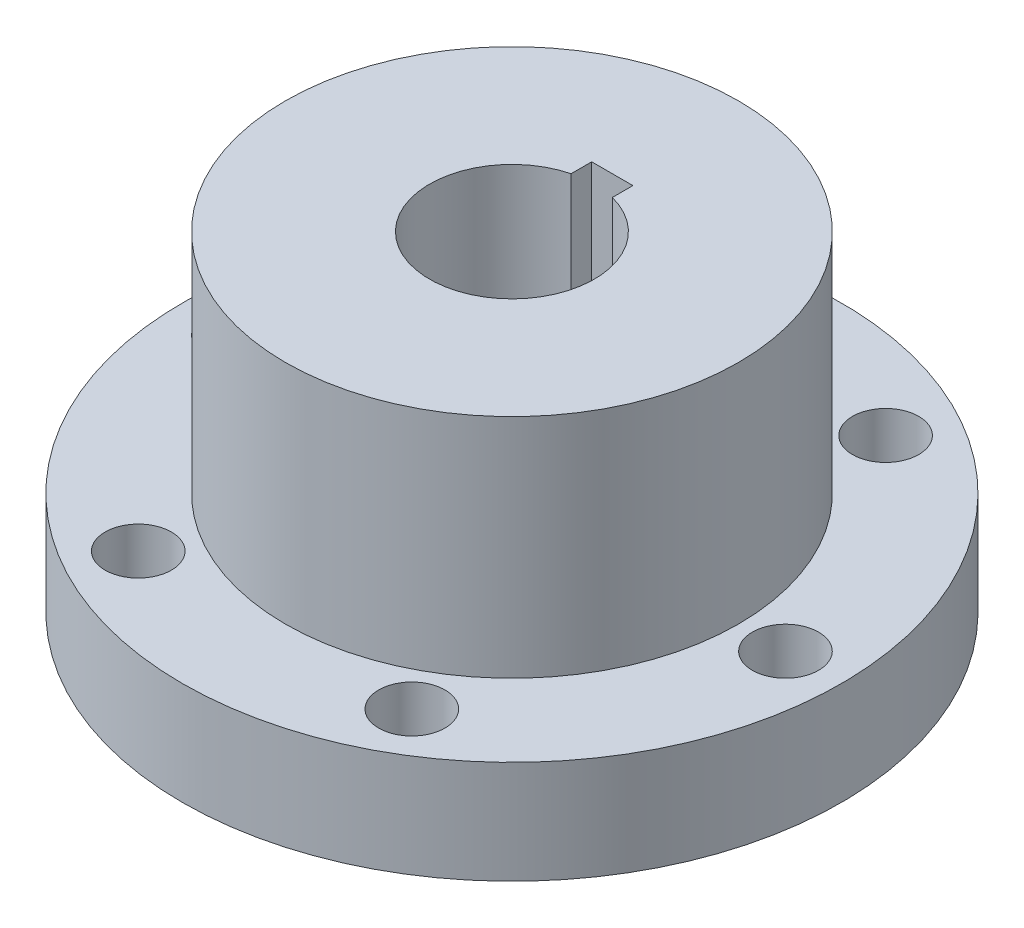
ISO-10303-21;
HEADER;
FILE_DESCRIPTION(('STEP AP214'),'2;1');
FILE_NAME('part.step','',(''),(''),'','','');
FILE_SCHEMA(('AUTOMOTIVE_DESIGN { 1 0 10303 214 1 1 1 1 }'));
ENDSEC;
DATA;
#1=APPLICATION_CONTEXT('core data for automotive mechanical design processes');
#2=APPLICATION_PROTOCOL_DEFINITION('international standard','automotive_design',2000,#1);
#3=PRODUCT_CONTEXT('',#1,'mechanical');
#4=PRODUCT('Part','Part','',(#3));
#5=PRODUCT_RELATED_PRODUCT_CATEGORY('part','',(#4));
#6=PRODUCT_DEFINITION_FORMATION('','',#4);
#7=PRODUCT_DEFINITION_CONTEXT('part definition',#1,'design');
#8=PRODUCT_DEFINITION('design','',#6,#7);
#9=PRODUCT_DEFINITION_SHAPE('','',#8);
#10=(LENGTH_UNIT() NAMED_UNIT(*) SI_UNIT(.MILLI.,.METRE.));
#11=(NAMED_UNIT(*) PLANE_ANGLE_UNIT() SI_UNIT($,.RADIAN.));
#12=(NAMED_UNIT(*) SI_UNIT($,.STERADIAN.) SOLID_ANGLE_UNIT());
#13=UNCERTAINTY_MEASURE_WITH_UNIT(LENGTH_MEASURE(1.E-05),#10,'distance_accuracy_value','');
#14=(GEOMETRIC_REPRESENTATION_CONTEXT(3) GLOBAL_UNCERTAINTY_ASSIGNED_CONTEXT((#13)) GLOBAL_UNIT_ASSIGNED_CONTEXT((#10,
#11,#12)) REPRESENTATION_CONTEXT('',''));
#15=CARTESIAN_POINT('',(0.,0.,0.));
#16=DIRECTION('',(0.,0.,1.));
#17=DIRECTION('',(1.,0.,0.));
#18=AXIS2_PLACEMENT_3D('',#15,#16,#17);
#19=CARTESIAN_POINT('',(0.,25.4,0.));
#20=DIRECTION('',(0.,-1.,0.));
#21=DIRECTION('',(0.,0.,-1.));
#22=AXIS2_PLACEMENT_3D('',#19,#20,#21);
#23=CYLINDRICAL_SURFACE('',#22,25.4);
#24=CARTESIAN_POINT('',(0.,0.,0.));
#25=DIRECTION('',(0.,1.,0.));
#26=DIRECTION('',(0.,0.,1.));
#27=AXIS2_PLACEMENT_3D('',#24,#25,#26);
#28=CIRCLE('',#27,25.4);
#29=CARTESIAN_POINT('',(0.,0.,25.4));
#30=VERTEX_POINT('',#29);
#31=EDGE_CURVE('E12',#30,#30,#28,.T.);
#32=ORIENTED_EDGE('',*,*,#31,.T.);
#33=EDGE_LOOP('',(#32));
#34=FACE_BOUND('',#33,.T.);
#35=CARTESIAN_POINT('',(0.,7.9375,0.));
#36=DIRECTION('',(0.,1.,0.));
#37=DIRECTION('',(0.,0.,1.));
#38=AXIS2_PLACEMENT_3D('',#35,#36,#37);
#39=CIRCLE('',#38,25.4);
#40=CARTESIAN_POINT('',(0.,7.9375,25.4));
#41=VERTEX_POINT('',#40);
#42=EDGE_CURVE('E58',#41,#41,#39,.T.);
#43=ORIENTED_EDGE('',*,*,#42,.F.);
#44=EDGE_LOOP('',(#43));
#45=FACE_BOUND('',#44,.T.);
#46=ADVANCED_FACE('F51',(#34,#45),#23,.T.);
#47=CARTESIAN_POINT('',(0.,0.,0.));
#48=DIRECTION('',(0.,1.,0.));
#49=DIRECTION('',(0.,0.,1.));
#50=AXIS2_PLACEMENT_3D('',#47,#48,#49);
#51=PLANE('',#50);
#52=CARTESIAN_POINT('',(21.082,0.,0.));
#53=DIRECTION('',(0.,1.,0.));
#54=DIRECTION('',(0.,0.,1.));
#55=AXIS2_PLACEMENT_3D('',#52,#53,#54);
#56=CIRCLE('',#55,2.5527);
#57=CARTESIAN_POINT('',(21.082,0.,2.5527));
#58=VERTEX_POINT('',#57);
#59=EDGE_CURVE('E200',#58,#58,#56,.T.);
#60=ORIENTED_EDGE('',*,*,#59,.T.);
#61=EDGE_LOOP('',(#60));
#62=FACE_BOUND('',#61,.T.);
#63=CARTESIAN_POINT('',(10.5410000000002,0.,-18.2575475625834));
#64=DIRECTION('',(0.,1.,0.));
#65=DIRECTION('',(0.,0.,1.));
#66=AXIS2_PLACEMENT_3D('',#63,#64,#65);
#67=CIRCLE('',#66,2.5527);
#68=CARTESIAN_POINT('',(10.5410000000002,0.,-15.7048475625834));
#69=VERTEX_POINT('',#68);
#70=EDGE_CURVE('E210',#69,#69,#67,.T.);
#71=ORIENTED_EDGE('',*,*,#70,.T.);
#72=EDGE_LOOP('',(#71));
#73=FACE_BOUND('',#72,.T.);
#74=CARTESIAN_POINT('',(-10.5409999999998,0.,-18.2575475625836));
#75=DIRECTION('',(0.,1.,0.));
#76=DIRECTION('',(0.,0.,1.));
#77=AXIS2_PLACEMENT_3D('',#74,#75,#76);
#78=CIRCLE('',#77,2.5527);
#79=CARTESIAN_POINT('',(-10.5409999999998,0.,-15.7048475625836));
#80=VERTEX_POINT('',#79);
#81=EDGE_CURVE('E216',#80,#80,#78,.T.);
#82=ORIENTED_EDGE('',*,*,#81,.T.);
#83=EDGE_LOOP('',(#82));
#84=FACE_BOUND('',#83,.T.);
#85=CARTESIAN_POINT('',(-21.082,0.,-1.47214819170982E-13));
#86=DIRECTION('',(0.,1.,0.));
#87=DIRECTION('',(0.,0.,1.));
#88=AXIS2_PLACEMENT_3D('',#85,#86,#87);
#89=CIRCLE('',#88,2.5527);
#90=CARTESIAN_POINT('',(-21.082,0.,2.55269999999985));
#91=VERTEX_POINT('',#90);
#92=EDGE_CURVE('E222',#91,#91,#89,.T.);
#93=ORIENTED_EDGE('',*,*,#92,.T.);
#94=EDGE_LOOP('',(#93));
#95=FACE_BOUND('',#94,.T.);
#96=CARTESIAN_POINT('',(-10.5410000000001,0.,18.2575475625835));
#97=DIRECTION('',(0.,1.,0.));
#98=DIRECTION('',(0.,0.,1.));
#99=AXIS2_PLACEMENT_3D('',#96,#97,#98);
#100=CIRCLE('',#99,2.5527);
#101=CARTESIAN_POINT('',(-10.5410000000001,0.,20.8102475625835));
#102=VERTEX_POINT('',#101);
#103=EDGE_CURVE('E228',#102,#102,#100,.T.);
#104=ORIENTED_EDGE('',*,*,#103,.T.);
#105=EDGE_LOOP('',(#104));
#106=FACE_BOUND('',#105,.T.);
#107=CARTESIAN_POINT('',(10.541,0.,18.2575475625836));
#108=DIRECTION('',(0.,1.,0.));
#109=DIRECTION('',(0.,0.,1.));
#110=AXIS2_PLACEMENT_3D('',#107,#108,#109);
#111=CIRCLE('',#110,2.5527);
#112=CARTESIAN_POINT('',(10.541,0.,20.8102475625836));
#113=VERTEX_POINT('',#112);
#114=EDGE_CURVE('E113',#113,#113,#111,.T.);
#115=ORIENTED_EDGE('',*,*,#114,.T.);
#116=EDGE_LOOP('',(#115));
#117=FACE_BOUND('',#116,.T.);
#118=DIRECTION('',(0.,0.,-1.));
#119=VECTOR('',#118,1.);
#120=CARTESIAN_POINT('',(-1.5875,0.,0.));
#121=LINE('',#120,#119);
#122=CARTESIAN_POINT('',(-1.5875,0.,-6.14836106210427));
#123=VERTEX_POINT('',#122);
#124=CARTESIAN_POINT('',(-1.5875,0.,-7.73586106210427));
#125=VERTEX_POINT('',#124);
#126=EDGE_CURVE('E96',#123,#125,#121,.T.);
#127=ORIENTED_EDGE('',*,*,#126,.F.);
#128=CARTESIAN_POINT('',(0.,0.,0.));
#129=DIRECTION('',(0.,1.,0.));
#130=DIRECTION('',(0.,0.,1.));
#131=AXIS2_PLACEMENT_3D('',#128,#129,#130);
#132=CIRCLE('',#131,6.35);
#133=CARTESIAN_POINT('',(1.5875,0.,-6.14836106210427));
#134=VERTEX_POINT('',#133);
#135=EDGE_CURVE('E93',#123,#134,#132,.T.);
#136=ORIENTED_EDGE('',*,*,#135,.T.);
#137=DIRECTION('',(0.,0.,-1.));
#138=VECTOR('',#137,1.);
#139=CARTESIAN_POINT('',(1.5875,0.,0.));
#140=LINE('',#139,#138);
#141=CARTESIAN_POINT('',(1.5875,0.,-7.73586106210427));
#142=VERTEX_POINT('',#141);
#143=EDGE_CURVE('E99',#134,#142,#140,.T.);
#144=ORIENTED_EDGE('',*,*,#143,.T.);
#145=DIRECTION('',(1.,0.,0.));
#146=VECTOR('',#145,1.);
#147=CARTESIAN_POINT('',(0.,0.,-7.73586106210427));
#148=LINE('',#147,#146);
#149=EDGE_CURVE('E103',#125,#142,#148,.T.);
#150=ORIENTED_EDGE('',*,*,#149,.F.);
#151=EDGE_LOOP('',(#127,#136,#144,#150));
#152=FACE_BOUND('',#151,.T.);
#153=ORIENTED_EDGE('',*,*,#31,.F.);
#154=EDGE_LOOP('',(#153));
#155=FACE_BOUND('',#154,.T.);
#156=ADVANCED_FACE('F105',(#62,#73,#84,#95,#106,#117,#152,#155),#51,.F.);
#157=CARTESIAN_POINT('',(0.,7.9375,0.));
#158=DIRECTION('',(0.,1.,0.));
#159=DIRECTION('',(0.,0.,1.));
#160=AXIS2_PLACEMENT_3D('',#157,#158,#159);
#161=PLANE('',#160);
#162=CARTESIAN_POINT('',(21.082,7.9375,0.));
#163=DIRECTION('',(0.,1.,0.));
#164=DIRECTION('',(0.,0.,1.));
#165=AXIS2_PLACEMENT_3D('',#162,#163,#164);
#166=CIRCLE('',#165,2.5527);
#167=CARTESIAN_POINT('',(21.082,7.9375,2.5527));
#168=VERTEX_POINT('',#167);
#169=EDGE_CURVE('E203',#168,#168,#166,.T.);
#170=ORIENTED_EDGE('',*,*,#169,.F.);
#171=EDGE_LOOP('',(#170));
#172=FACE_BOUND('',#171,.T.);
#173=CARTESIAN_POINT('',(10.5410000000002,7.9375,-18.2575475625834));
#174=DIRECTION('',(0.,1.,0.));
#175=DIRECTION('',(0.,0.,1.));
#176=AXIS2_PLACEMENT_3D('',#173,#174,#175);
#177=CIRCLE('',#176,2.5527);
#178=CARTESIAN_POINT('',(10.5410000000002,7.9375,-15.7048475625834));
#179=VERTEX_POINT('',#178);
#180=EDGE_CURVE('E205',#179,#179,#177,.T.);
#181=ORIENTED_EDGE('',*,*,#180,.F.);
#182=EDGE_LOOP('',(#181));
#183=FACE_BOUND('',#182,.T.);
#184=CARTESIAN_POINT('',(-10.5409999999998,7.9375,-18.2575475625836));
#185=DIRECTION('',(0.,1.,0.));
#186=DIRECTION('',(0.,0.,1.));
#187=AXIS2_PLACEMENT_3D('',#184,#185,#186);
#188=CIRCLE('',#187,2.5527);
#189=CARTESIAN_POINT('',(-10.5409999999998,7.9375,-15.7048475625836));
#190=VERTEX_POINT('',#189);
#191=EDGE_CURVE('E213',#190,#190,#188,.T.);
#192=ORIENTED_EDGE('',*,*,#191,.F.);
#193=EDGE_LOOP('',(#192));
#194=FACE_BOUND('',#193,.T.);
#195=CARTESIAN_POINT('',(-21.082,7.9375,-1.47214819170982E-13));
#196=DIRECTION('',(0.,1.,0.));
#197=DIRECTION('',(0.,0.,1.));
#198=AXIS2_PLACEMENT_3D('',#195,#196,#197);
#199=CIRCLE('',#198,2.5527);
#200=CARTESIAN_POINT('',(-21.082,7.9375,2.55269999999985));
#201=VERTEX_POINT('',#200);
#202=EDGE_CURVE('E219',#201,#201,#199,.T.);
#203=ORIENTED_EDGE('',*,*,#202,.F.);
#204=EDGE_LOOP('',(#203));
#205=FACE_BOUND('',#204,.T.);
#206=CARTESIAN_POINT('',(-10.5410000000001,7.9375,18.2575475625835));
#207=DIRECTION('',(0.,1.,0.));
#208=DIRECTION('',(0.,0.,1.));
#209=AXIS2_PLACEMENT_3D('',#206,#207,#208);
#210=CIRCLE('',#209,2.5527);
#211=CARTESIAN_POINT('',(-10.5410000000001,7.9375,20.8102475625835));
#212=VERTEX_POINT('',#211);
#213=EDGE_CURVE('E225',#212,#212,#210,.T.);
#214=ORIENTED_EDGE('',*,*,#213,.F.);
#215=EDGE_LOOP('',(#214));
#216=FACE_BOUND('',#215,.T.);
#217=CARTESIAN_POINT('',(10.541,7.9375,18.2575475625836));
#218=DIRECTION('',(0.,1.,0.));
#219=DIRECTION('',(0.,0.,1.));
#220=AXIS2_PLACEMENT_3D('',#217,#218,#219);
#221=CIRCLE('',#220,2.5527);
#222=CARTESIAN_POINT('',(10.541,7.9375,20.8102475625836));
#223=VERTEX_POINT('',#222);
#224=EDGE_CURVE('E230',#223,#223,#221,.T.);
#225=ORIENTED_EDGE('',*,*,#224,.F.);
#226=EDGE_LOOP('',(#225));
#227=FACE_BOUND('',#226,.T.);
#228=CARTESIAN_POINT('',(0.,7.9375,0.));
#229=DIRECTION('',(0.,1.,0.));
#230=DIRECTION('',(0.,0.,1.));
#231=AXIS2_PLACEMENT_3D('',#228,#229,#230);
#232=CIRCLE('',#231,17.4625);
#233=CARTESIAN_POINT('',(0.,7.9375,17.4625));
#234=VERTEX_POINT('',#233);
#235=EDGE_CURVE('E129',#234,#234,#232,.T.);
#236=ORIENTED_EDGE('',*,*,#235,.F.);
#237=EDGE_LOOP('',(#236));
#238=FACE_BOUND('',#237,.T.);
#239=ORIENTED_EDGE('',*,*,#42,.T.);
#240=EDGE_LOOP('',(#239));
#241=FACE_BOUND('',#240,.T.);
#242=ADVANCED_FACE('F136',(#172,#183,#194,#205,#216,#227,#238,#241),#161,.T.);
#243=CARTESIAN_POINT('',(0.,7.9375,0.));
#244=DIRECTION('',(0.,1.,0.));
#245=DIRECTION('',(0.,0.,1.));
#246=AXIS2_PLACEMENT_3D('',#243,#244,#245);
#247=CYLINDRICAL_SURFACE('',#246,17.4625);
#248=ORIENTED_EDGE('',*,*,#235,.T.);
#249=EDGE_LOOP('',(#248));
#250=FACE_BOUND('',#249,.T.);
#251=CARTESIAN_POINT('',(0.,25.4,0.));
#252=DIRECTION('',(0.,1.,0.));
#253=DIRECTION('',(0.,0.,1.));
#254=AXIS2_PLACEMENT_3D('',#251,#252,#253);
#255=CIRCLE('',#254,17.4625);
#256=CARTESIAN_POINT('',(0.,25.4,17.4625));
#257=VERTEX_POINT('',#256);
#258=EDGE_CURVE('E125',#257,#257,#255,.T.);
#259=ORIENTED_EDGE('',*,*,#258,.F.);
#260=EDGE_LOOP('',(#259));
#261=FACE_BOUND('',#260,.T.);
#262=ADVANCED_FACE('F148',(#250,#261),#247,.T.);
#263=CARTESIAN_POINT('',(0.,25.4,0.));
#264=DIRECTION('',(0.,1.,0.));
#265=DIRECTION('',(0.,0.,1.));
#266=AXIS2_PLACEMENT_3D('',#263,#264,#265);
#267=PLANE('',#266);
#268=CARTESIAN_POINT('',(0.,25.4,0.));
#269=DIRECTION('',(0.,1.,0.));
#270=DIRECTION('',(0.,0.,1.));
#271=AXIS2_PLACEMENT_3D('',#268,#269,#270);
#272=CIRCLE('',#271,6.35);
#273=CARTESIAN_POINT('',(-1.5875,25.4,-6.14836106210427));
#274=VERTEX_POINT('',#273);
#275=CARTESIAN_POINT('',(1.5875,25.4,-6.14836106210427));
#276=VERTEX_POINT('',#275);
#277=EDGE_CURVE('E73',#274,#276,#272,.T.);
#278=ORIENTED_EDGE('',*,*,#277,.F.);
#279=DIRECTION('',(0.,0.,-1.));
#280=VECTOR('',#279,1.);
#281=CARTESIAN_POINT('',(-1.5875,25.4,0.));
#282=LINE('',#281,#280);
#283=CARTESIAN_POINT('',(-1.5875,25.4,-7.73586106210427));
#284=VERTEX_POINT('',#283);
#285=EDGE_CURVE('E107',#274,#284,#282,.T.);
#286=ORIENTED_EDGE('',*,*,#285,.T.);
#287=DIRECTION('',(1.,0.,0.));
#288=VECTOR('',#287,1.);
#289=CARTESIAN_POINT('',(0.,25.4,-7.73586106210427));
#290=LINE('',#289,#288);
#291=CARTESIAN_POINT('',(1.5875,25.4,-7.73586106210427));
#292=VERTEX_POINT('',#291);
#293=EDGE_CURVE('E110',#284,#292,#290,.T.);
#294=ORIENTED_EDGE('',*,*,#293,.T.);
#295=DIRECTION('',(0.,0.,-1.));
#296=VECTOR('',#295,1.);
#297=CARTESIAN_POINT('',(1.5875,25.4,0.));
#298=LINE('',#297,#296);
#299=EDGE_CURVE('E119',#276,#292,#298,.T.);
#300=ORIENTED_EDGE('',*,*,#299,.F.);
#301=EDGE_LOOP('',(#278,#286,#294,#300));
#302=FACE_BOUND('',#301,.T.);
#303=ORIENTED_EDGE('',*,*,#258,.T.);
#304=EDGE_LOOP('',(#303));
#305=FACE_BOUND('',#304,.T.);
#306=ADVANCED_FACE('F154',(#302,#305),#267,.T.);
#307=CARTESIAN_POINT('',(0.,0.,0.));
#308=DIRECTION('',(0.,1.,0.));
#309=DIRECTION('',(0.,0.,1.));
#310=AXIS2_PLACEMENT_3D('',#307,#308,#309);
#311=CYLINDRICAL_SURFACE('',#310,6.35);
#312=ORIENTED_EDGE('',*,*,#277,.T.);
#313=DIRECTION('',(0.,1.,0.));
#314=VECTOR('',#313,1.);
#315=CARTESIAN_POINT('',(1.5875,0.,-6.14836106210427));
#316=LINE('',#315,#314);
#317=EDGE_CURVE('E90',#134,#276,#316,.T.);
#318=ORIENTED_EDGE('',*,*,#317,.F.);
#319=ORIENTED_EDGE('',*,*,#135,.F.);
#320=DIRECTION('',(0.,1.,0.));
#321=VECTOR('',#320,1.);
#322=CARTESIAN_POINT('',(-1.5875,0.,-6.14836106210427));
#323=LINE('',#322,#321);
#324=EDGE_CURVE('E123',#123,#274,#323,.T.);
#325=ORIENTED_EDGE('',*,*,#324,.T.);
#326=EDGE_LOOP('',(#312,#318,#319,#325));
#327=FACE_BOUND('',#326,.T.);
#328=ADVANCED_FACE('F91',(#327),#311,.F.);
#329=CARTESIAN_POINT('',(-1.5875,0.,0.));
#330=DIRECTION('',(1.,0.,0.));
#331=DIRECTION('',(0.,0.,-1.));
#332=AXIS2_PLACEMENT_3D('',#329,#330,#331);
#333=PLANE('',#332);
#334=ORIENTED_EDGE('',*,*,#285,.F.);
#335=ORIENTED_EDGE('',*,*,#324,.F.);
#336=ORIENTED_EDGE('',*,*,#126,.T.);
#337=DIRECTION('',(0.,1.,0.));
#338=VECTOR('',#337,1.);
#339=CARTESIAN_POINT('',(-1.5875,0.,-7.73586106210427));
#340=LINE('',#339,#338);
#341=EDGE_CURVE('E126',#125,#284,#340,.T.);
#342=ORIENTED_EDGE('',*,*,#341,.T.);
#343=EDGE_LOOP('',(#334,#335,#336,#342));
#344=FACE_BOUND('',#343,.T.);
#345=ADVANCED_FACE('F163',(#344),#333,.T.);
#346=CARTESIAN_POINT('',(0.,0.,-7.73586106210427));
#347=DIRECTION('',(0.,0.,1.));
#348=DIRECTION('',(1.,0.,0.));
#349=AXIS2_PLACEMENT_3D('',#346,#347,#348);
#350=PLANE('',#349);
#351=ORIENTED_EDGE('',*,*,#293,.F.);
#352=ORIENTED_EDGE('',*,*,#341,.F.);
#353=ORIENTED_EDGE('',*,*,#149,.T.);
#354=DIRECTION('',(0.,1.,0.));
#355=VECTOR('',#354,1.);
#356=CARTESIAN_POINT('',(1.5875,0.,-7.73586106210427));
#357=LINE('',#356,#355);
#358=EDGE_CURVE('E65',#142,#292,#357,.T.);
#359=ORIENTED_EDGE('',*,*,#358,.T.);
#360=EDGE_LOOP('',(#351,#352,#353,#359));
#361=FACE_BOUND('',#360,.T.);
#362=ADVANCED_FACE('F167',(#361),#350,.T.);
#363=CARTESIAN_POINT('',(1.5875,0.,0.));
#364=DIRECTION('',(1.,0.,0.));
#365=DIRECTION('',(0.,0.,-1.));
#366=AXIS2_PLACEMENT_3D('',#363,#364,#365);
#367=PLANE('',#366);
#368=ORIENTED_EDGE('',*,*,#299,.T.);
#369=ORIENTED_EDGE('',*,*,#358,.F.);
#370=ORIENTED_EDGE('',*,*,#143,.F.);
#371=ORIENTED_EDGE('',*,*,#317,.T.);
#372=EDGE_LOOP('',(#368,#369,#370,#371));
#373=FACE_BOUND('',#372,.T.);
#374=ADVANCED_FACE('F100',(#373),#367,.F.);
#375=CARTESIAN_POINT('',(10.541,7.9375,18.2575475625836));
#376=DIRECTION('',(0.,1.,0.));
#377=DIRECTION('',(0.,0.,1.));
#378=AXIS2_PLACEMENT_3D('',#375,#376,#377);
#379=CYLINDRICAL_SURFACE('',#378,2.5527);
#380=ORIENTED_EDGE('',*,*,#114,.F.);
#381=EDGE_LOOP('',(#380));
#382=FACE_BOUND('',#381,.T.);
#383=ORIENTED_EDGE('',*,*,#224,.T.);
#384=EDGE_LOOP('',(#383));
#385=FACE_BOUND('',#384,.T.);
#386=ADVANCED_FACE('F166',(#382,#385),#379,.F.);
#387=CARTESIAN_POINT('',(-10.5410000000001,7.9375,18.2575475625835));
#388=DIRECTION('',(0.,1.,0.));
#389=DIRECTION('',(0.,0.,1.));
#390=AXIS2_PLACEMENT_3D('',#387,#388,#389);
#391=CYLINDRICAL_SURFACE('',#390,2.5527);
#392=ORIENTED_EDGE('',*,*,#103,.F.);
#393=EDGE_LOOP('',(#392));
#394=FACE_BOUND('',#393,.T.);
#395=ORIENTED_EDGE('',*,*,#213,.T.);
#396=EDGE_LOOP('',(#395));
#397=FACE_BOUND('',#396,.T.);
#398=ADVANCED_FACE('F176',(#394,#397),#391,.F.);
#399=CARTESIAN_POINT('',(-21.082,7.9375,-1.47214819170982E-13));
#400=DIRECTION('',(0.,1.,0.));
#401=DIRECTION('',(0.,0.,1.));
#402=AXIS2_PLACEMENT_3D('',#399,#400,#401);
#403=CYLINDRICAL_SURFACE('',#402,2.5527);
#404=ORIENTED_EDGE('',*,*,#92,.F.);
#405=EDGE_LOOP('',(#404));
#406=FACE_BOUND('',#405,.T.);
#407=ORIENTED_EDGE('',*,*,#202,.T.);
#408=EDGE_LOOP('',(#407));
#409=FACE_BOUND('',#408,.T.);
#410=ADVANCED_FACE('F180',(#406,#409),#403,.F.);
#411=CARTESIAN_POINT('',(-10.5409999999998,7.9375,-18.2575475625836));
#412=DIRECTION('',(0.,1.,0.));
#413=DIRECTION('',(0.,0.,1.));
#414=AXIS2_PLACEMENT_3D('',#411,#412,#413);
#415=CYLINDRICAL_SURFACE('',#414,2.5527);
#416=ORIENTED_EDGE('',*,*,#81,.F.);
#417=EDGE_LOOP('',(#416));
#418=FACE_BOUND('',#417,.T.);
#419=ORIENTED_EDGE('',*,*,#191,.T.);
#420=EDGE_LOOP('',(#419));
#421=FACE_BOUND('',#420,.T.);
#422=ADVANCED_FACE('F184',(#418,#421),#415,.F.);
#423=CARTESIAN_POINT('',(10.5410000000002,7.9375,-18.2575475625834));
#424=DIRECTION('',(0.,1.,0.));
#425=DIRECTION('',(0.,0.,1.));
#426=AXIS2_PLACEMENT_3D('',#423,#424,#425);
#427=CYLINDRICAL_SURFACE('',#426,2.5527);
#428=ORIENTED_EDGE('',*,*,#70,.F.);
#429=EDGE_LOOP('',(#428));
#430=FACE_BOUND('',#429,.T.);
#431=ORIENTED_EDGE('',*,*,#180,.T.);
#432=EDGE_LOOP('',(#431));
#433=FACE_BOUND('',#432,.T.);
#434=ADVANCED_FACE('F188',(#430,#433),#427,.F.);
#435=CARTESIAN_POINT('',(21.082,7.9375,0.));
#436=DIRECTION('',(0.,1.,0.));
#437=DIRECTION('',(0.,0.,1.));
#438=AXIS2_PLACEMENT_3D('',#435,#436,#437);
#439=CYLINDRICAL_SURFACE('',#438,2.5527);
#440=ORIENTED_EDGE('',*,*,#59,.F.);
#441=EDGE_LOOP('',(#440));
#442=FACE_BOUND('',#441,.T.);
#443=ORIENTED_EDGE('',*,*,#169,.T.);
#444=EDGE_LOOP('',(#443));
#445=FACE_BOUND('',#444,.T.);
#446=ADVANCED_FACE('F192',(#442,#445),#439,.F.);
#447=CLOSED_SHELL('',(#46,#156,#242,#262,#306,#328,#345,#362,#374,#386,#398,#410,#422,#434,#446));
#448=MANIFOLD_SOLID_BREP('B2',#447);
#449=ADVANCED_BREP_SHAPE_REPRESENTATION('',(#18,#448),#14);
#450=SHAPE_DEFINITION_REPRESENTATION(#9,#449);
ENDSEC;
END-ISO-10303-21;
